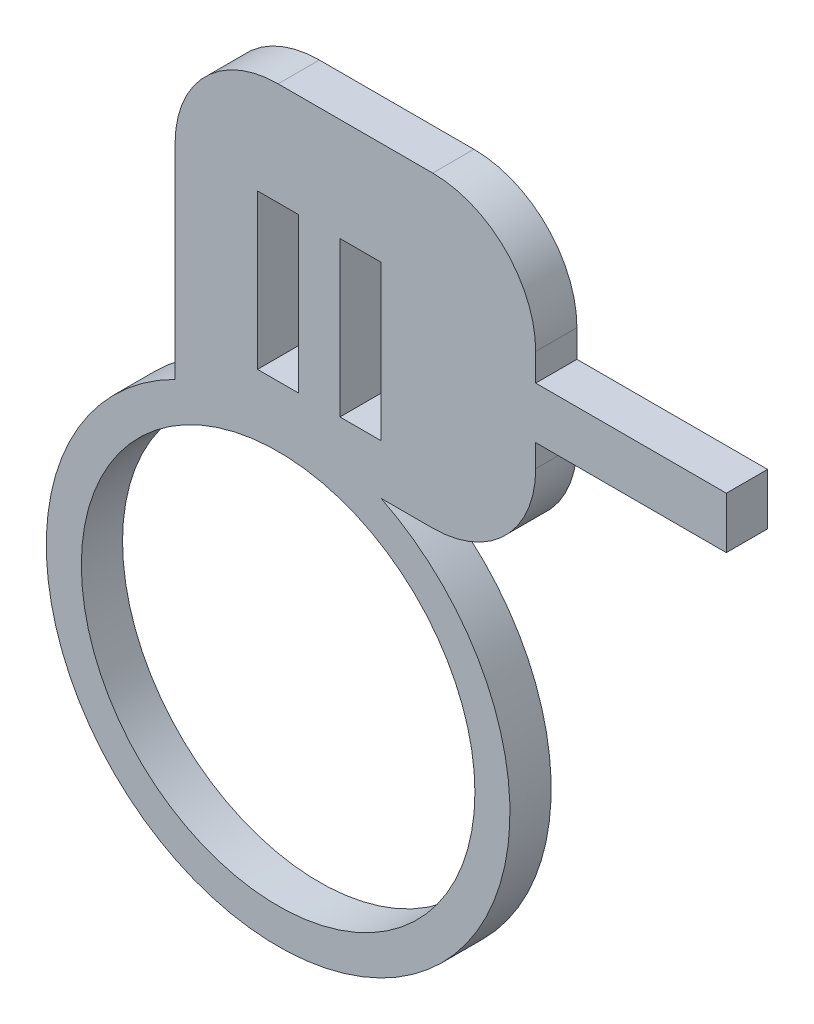
ISO-10303-21;
HEADER;
FILE_DESCRIPTION(('STEP AP214'),'2;1');
FILE_NAME('part.step','',(''),(''),'','','');
FILE_SCHEMA(('AUTOMOTIVE_DESIGN { 1 0 10303 214 1 1 1 1 }'));
ENDSEC;
DATA;
#1=APPLICATION_CONTEXT('core data for automotive mechanical design processes');
#2=APPLICATION_PROTOCOL_DEFINITION('international standard','automotive_design',2000,#1);
#3=PRODUCT_CONTEXT('',#1,'mechanical');
#4=PRODUCT('Part','Part','',(#3));
#5=PRODUCT_RELATED_PRODUCT_CATEGORY('part','',(#4));
#6=PRODUCT_DEFINITION_FORMATION('','',#4);
#7=PRODUCT_DEFINITION_CONTEXT('part definition',#1,'design');
#8=PRODUCT_DEFINITION('design','',#6,#7);
#9=PRODUCT_DEFINITION_SHAPE('','',#8);
#10=(LENGTH_UNIT() NAMED_UNIT(*) SI_UNIT(.MILLI.,.METRE.));
#11=(NAMED_UNIT(*) PLANE_ANGLE_UNIT() SI_UNIT($,.RADIAN.));
#12=(NAMED_UNIT(*) SI_UNIT($,.STERADIAN.) SOLID_ANGLE_UNIT());
#13=UNCERTAINTY_MEASURE_WITH_UNIT(LENGTH_MEASURE(1.E-05),#10,'distance_accuracy_value','');
#14=(GEOMETRIC_REPRESENTATION_CONTEXT(3) GLOBAL_UNCERTAINTY_ASSIGNED_CONTEXT((#13)) GLOBAL_UNIT_ASSIGNED_CONTEXT((#10,
#11,#12)) REPRESENTATION_CONTEXT('',''));
#15=CARTESIAN_POINT('',(0.,0.,0.));
#16=DIRECTION('',(0.,0.,1.));
#17=DIRECTION('',(1.,0.,0.));
#18=AXIS2_PLACEMENT_3D('',#15,#16,#17);
#19=CARTESIAN_POINT('',(31.75,0.,0.));
#20=DIRECTION('',(1.,0.,0.));
#21=DIRECTION('',(0.,0.,-1.));
#22=AXIS2_PLACEMENT_3D('',#19,#20,#21);
#23=PLANE('',#22);
#24=DIRECTION('',(0.,-1.,0.));
#25=VECTOR('',#24,1.);
#26=CARTESIAN_POINT('',(31.75,25.5976683508479,5.08));
#27=LINE('',#26,#25);
#28=CARTESIAN_POINT('',(31.75,50.8,5.08));
#29=VERTEX_POINT('',#28);
#30=CARTESIAN_POINT('',(31.75,47.4268816999342,5.08));
#31=VERTEX_POINT('',#30);
#32=EDGE_CURVE('E224',#29,#31,#27,.T.);
#33=ORIENTED_EDGE('',*,*,#32,.T.);
#34=DIRECTION('',(0.,0.,1.));
#35=VECTOR('',#34,1.);
#36=CARTESIAN_POINT('',(31.75,47.4268816999342,0.));
#37=LINE('',#36,#35);
#38=CARTESIAN_POINT('',(31.75,47.4268816999342,0.));
#39=VERTEX_POINT('',#38);
#40=EDGE_CURVE('E336',#39,#31,#37,.T.);
#41=ORIENTED_EDGE('',*,*,#40,.F.);
#42=DIRECTION('',(0.,1.,0.));
#43=VECTOR('',#42,1.);
#44=CARTESIAN_POINT('',(31.75,25.5976683508479,0.));
#45=LINE('',#44,#43);
#46=CARTESIAN_POINT('',(31.75,50.8,0.));
#47=VERTEX_POINT('',#46);
#48=EDGE_CURVE('E195',#39,#47,#45,.T.);
#49=ORIENTED_EDGE('',*,*,#48,.T.);
#50=DIRECTION('',(0.,0.,1.));
#51=VECTOR('',#50,1.);
#52=CARTESIAN_POINT('',(31.75,50.8,0.));
#53=LINE('',#52,#51);
#54=EDGE_CURVE('E300',#47,#29,#53,.T.);
#55=ORIENTED_EDGE('',*,*,#54,.T.);
#56=EDGE_LOOP('',(#33,#41,#49,#55));
#57=FACE_BOUND('',#56,.T.);
#58=ADVANCED_FACE('F34',(#57),#23,.T.);
#59=CARTESIAN_POINT('',(31.75,38.2976683508479,0.));
#60=VERTEX_POINT('',#59);
#61=CARTESIAN_POINT('',(31.75,41.0768816999342,0.));
#62=VERTEX_POINT('',#61);
#63=EDGE_CURVE('E220',#60,#62,#45,.T.);
#64=ORIENTED_EDGE('',*,*,#63,.T.);
#65=DIRECTION('',(0.,0.,-1.));
#66=VECTOR('',#65,1.);
#67=CARTESIAN_POINT('',(31.75,41.0768816999342,0.));
#68=LINE('',#67,#66);
#69=CARTESIAN_POINT('',(31.75,41.0768816999342,5.08));
#70=VERTEX_POINT('',#69);
#71=EDGE_CURVE('E189',#70,#62,#68,.T.);
#72=ORIENTED_EDGE('',*,*,#71,.F.);
#73=CARTESIAN_POINT('',(31.75,38.2976683508479,5.08));
#74=VERTEX_POINT('',#73);
#75=EDGE_CURVE('E223',#70,#74,#27,.T.);
#76=ORIENTED_EDGE('',*,*,#75,.T.);
#77=DIRECTION('',(0.,0.,-1.));
#78=VECTOR('',#77,1.);
#79=CARTESIAN_POINT('',(31.75,38.2976683508479,0.));
#80=LINE('',#79,#78);
#81=EDGE_CURVE('E303',#74,#60,#80,.T.);
#82=ORIENTED_EDGE('',*,*,#81,.T.);
#83=EDGE_LOOP('',(#64,#72,#76,#82));
#84=FACE_BOUND('',#83,.T.);
#85=ADVANCED_FACE('F358',(#84),#23,.T.);
#86=CARTESIAN_POINT('',(0.,0.,5.08));
#87=DIRECTION('',(0.,0.,-1.));
#88=DIRECTION('',(-1.,0.,0.));
#89=AXIS2_PLACEMENT_3D('',#86,#87,#88);
#90=CYLINDRICAL_SURFACE('',#89,28.575);
#91=DIRECTION('',(0.,0.,-1.));
#92=VECTOR('',#91,1.);
#93=CARTESIAN_POINT('',(12.7,25.5976683508479,5.08));
#94=LINE('',#93,#92);
#95=CARTESIAN_POINT('',(12.7,25.5976683508479,5.08));
#96=VERTEX_POINT('',#95);
#97=CARTESIAN_POINT('',(12.7,25.5976683508479,0.));
#98=VERTEX_POINT('',#97);
#99=EDGE_CURVE('E279',#96,#98,#94,.T.);
#100=ORIENTED_EDGE('',*,*,#99,.F.);
#101=CARTESIAN_POINT('',(0.,0.,5.08));
#102=DIRECTION('',(0.,0.,1.));
#103=DIRECTION('',(1.,0.,0.));
#104=AXIS2_PLACEMENT_3D('',#101,#102,#103);
#105=CIRCLE('',#104,28.575);
#106=CARTESIAN_POINT('',(-12.7,25.5976683508479,5.08));
#107=VERTEX_POINT('',#106);
#108=EDGE_CURVE('E283',#107,#96,#105,.T.);
#109=ORIENTED_EDGE('',*,*,#108,.F.);
#110=DIRECTION('',(0.,0.,-1.));
#111=VECTOR('',#110,1.);
#112=CARTESIAN_POINT('',(-12.7,25.5976683508479,5.08));
#113=LINE('',#112,#111);
#114=CARTESIAN_POINT('',(-12.7,25.5976683508479,0.));
#115=VERTEX_POINT('',#114);
#116=EDGE_CURVE('E276',#115,#107,#113,.F.);
#117=ORIENTED_EDGE('',*,*,#116,.F.);
#118=CARTESIAN_POINT('',(0.,0.,0.));
#119=DIRECTION('',(0.,0.,1.));
#120=DIRECTION('',(1.,0.,0.));
#121=AXIS2_PLACEMENT_3D('',#118,#119,#120);
#122=CIRCLE('',#121,28.575);
#123=EDGE_CURVE('E282',#115,#98,#122,.T.);
#124=ORIENTED_EDGE('',*,*,#123,.T.);
#125=EDGE_LOOP('',(#100,#109,#117,#124));
#126=FACE_BOUND('',#125,.T.);
#127=ADVANCED_FACE('F348',(#126),#90,.T.);
#128=CARTESIAN_POINT('',(0.,0.,5.08));
#129=DIRECTION('',(0.,0.,1.));
#130=DIRECTION('',(1.,0.,0.));
#131=AXIS2_PLACEMENT_3D('',#128,#129,#130);
#132=PLANE('',#131);
#133=DIRECTION('',(0.,-1.,0.));
#134=VECTOR('',#133,1.);
#135=CARTESIAN_POINT('',(7.61999999999999,31.75,5.08));
#136=LINE('',#135,#134);
#137=CARTESIAN_POINT('',(7.61999999999999,50.8,5.08));
#138=VERTEX_POINT('',#137);
#139=CARTESIAN_POINT('',(7.61999999999999,31.75,5.08));
#140=VERTEX_POINT('',#139);
#141=EDGE_CURVE('E196',#138,#140,#136,.T.);
#142=ORIENTED_EDGE('',*,*,#141,.F.);
#143=DIRECTION('',(-1.,0.,0.));
#144=VECTOR('',#143,1.);
#145=CARTESIAN_POINT('',(7.61999999999999,50.8,5.08));
#146=LINE('',#145,#144);
#147=CARTESIAN_POINT('',(12.7,50.8,5.08));
#148=VERTEX_POINT('',#147);
#149=EDGE_CURVE('E208',#148,#138,#146,.T.);
#150=ORIENTED_EDGE('',*,*,#149,.F.);
#151=DIRECTION('',(0.,1.,0.));
#152=VECTOR('',#151,1.);
#153=CARTESIAN_POINT('',(12.7,31.75,5.08));
#154=LINE('',#153,#152);
#155=CARTESIAN_POINT('',(12.7,31.75,5.08));
#156=VERTEX_POINT('',#155);
#157=EDGE_CURVE('E205',#156,#148,#154,.T.);
#158=ORIENTED_EDGE('',*,*,#157,.F.);
#159=DIRECTION('',(1.,0.,0.));
#160=VECTOR('',#159,1.);
#161=CARTESIAN_POINT('',(7.61999999999999,31.75,5.08));
#162=LINE('',#161,#160);
#163=EDGE_CURVE('E198',#140,#156,#162,.T.);
#164=ORIENTED_EDGE('',*,*,#163,.F.);
#165=EDGE_LOOP('',(#142,#150,#158,#164));
#166=FACE_BOUND('',#165,.T.);
#167=DIRECTION('',(0.,1.,0.));
#168=VECTOR('',#167,1.);
#169=CARTESIAN_POINT('',(2.53999999999999,0.,5.08));
#170=LINE('',#169,#168);
#171=CARTESIAN_POINT('',(2.53999999999999,31.75,5.08));
#172=VERTEX_POINT('',#171);
#173=CARTESIAN_POINT('',(2.53999999999999,50.8,5.08));
#174=VERTEX_POINT('',#173);
#175=EDGE_CURVE('E258',#172,#174,#170,.T.);
#176=ORIENTED_EDGE('',*,*,#175,.F.);
#177=DIRECTION('',(1.,0.,0.));
#178=VECTOR('',#177,1.);
#179=CARTESIAN_POINT('',(0.,31.75,5.08));
#180=LINE('',#179,#178);
#181=CARTESIAN_POINT('',(-2.54000000000001,31.75,5.08));
#182=VERTEX_POINT('',#181);
#183=EDGE_CURVE('E245',#182,#172,#180,.T.);
#184=ORIENTED_EDGE('',*,*,#183,.F.);
#185=DIRECTION('',(0.,-1.,0.));
#186=VECTOR('',#185,1.);
#187=CARTESIAN_POINT('',(-2.54000000000001,0.,5.08));
#188=LINE('',#187,#186);
#189=CARTESIAN_POINT('',(-2.54000000000001,50.8,5.08));
#190=VERTEX_POINT('',#189);
#191=EDGE_CURVE('E253',#190,#182,#188,.T.);
#192=ORIENTED_EDGE('',*,*,#191,.F.);
#193=DIRECTION('',(-1.,0.,0.));
#194=VECTOR('',#193,1.);
#195=CARTESIAN_POINT('',(0.,50.8,5.08));
#196=LINE('',#195,#194);
#197=EDGE_CURVE('E256',#174,#190,#196,.T.);
#198=ORIENTED_EDGE('',*,*,#197,.F.);
#199=EDGE_LOOP('',(#176,#184,#192,#198));
#200=FACE_BOUND('',#199,.T.);
#201=CARTESIAN_POINT('',(0.,0.,5.08));
#202=DIRECTION('',(0.,0.,1.));
#203=DIRECTION('',(1.,0.,0.));
#204=AXIS2_PLACEMENT_3D('',#201,#202,#203);
#205=CIRCLE('',#204,24.257);
#206=CARTESIAN_POINT('',(24.257,0.,5.08));
#207=VERTEX_POINT('',#206);
#208=EDGE_CURVE('E263',#207,#207,#205,.T.);
#209=ORIENTED_EDGE('',*,*,#208,.F.);
#210=EDGE_LOOP('',(#209));
#211=FACE_BOUND('',#210,.T.);
#212=DIRECTION('',(-1.,0.,0.));
#213=VECTOR('',#212,1.);
#214=CARTESIAN_POINT('',(31.75,25.5976683508479,5.08));
#215=LINE('',#214,#213);
#216=CARTESIAN_POINT('',(19.05,25.5976683508479,5.08));
#217=VERTEX_POINT('',#216);
#218=EDGE_CURVE('E229',#217,#96,#215,.T.);
#219=ORIENTED_EDGE('',*,*,#218,.F.);
#220=CARTESIAN_POINT('',(19.05,38.2976683508479,5.08));
#221=DIRECTION('',(0.,0.,1.));
#222=DIRECTION('',(1.,0.,0.));
#223=AXIS2_PLACEMENT_3D('',#220,#221,#222);
#224=CIRCLE('',#223,12.7);
#225=EDGE_CURVE('E317',#217,#74,#224,.T.);
#226=ORIENTED_EDGE('',*,*,#225,.T.);
#227=ORIENTED_EDGE('',*,*,#75,.F.);
#228=DIRECTION('',(-1.,0.,0.));
#229=VECTOR('',#228,1.);
#230=CARTESIAN_POINT('',(55.245,41.0768816999342,5.08));
#231=LINE('',#230,#229);
#232=CARTESIAN_POINT('',(55.245,41.0768816999342,5.08));
#233=VERTEX_POINT('',#232);
#234=EDGE_CURVE('E49',#233,#70,#231,.T.);
#235=ORIENTED_EDGE('',*,*,#234,.F.);
#236=DIRECTION('',(0.,-1.,0.));
#237=VECTOR('',#236,1.);
#238=CARTESIAN_POINT('',(55.245,41.0768816999342,5.08));
#239=LINE('',#238,#237);
#240=CARTESIAN_POINT('',(55.245,47.4268816999342,5.08));
#241=VERTEX_POINT('',#240);
#242=EDGE_CURVE('E180',#241,#233,#239,.T.);
#243=ORIENTED_EDGE('',*,*,#242,.F.);
#244=DIRECTION('',(-1.,0.,0.));
#245=VECTOR('',#244,1.);
#246=CARTESIAN_POINT('',(55.245,47.4268816999342,5.08));
#247=LINE('',#246,#245);
#248=EDGE_CURVE('E177',#241,#31,#247,.T.);
#249=ORIENTED_EDGE('',*,*,#248,.T.);
#250=ORIENTED_EDGE('',*,*,#32,.F.);
#251=CARTESIAN_POINT('',(19.05,50.8,5.08));
#252=DIRECTION('',(0.,0.,1.));
#253=DIRECTION('',(1.,0.,0.));
#254=AXIS2_PLACEMENT_3D('',#251,#252,#253);
#255=CIRCLE('',#254,12.7);
#256=CARTESIAN_POINT('',(19.05,63.5,5.08));
#257=VERTEX_POINT('',#256);
#258=EDGE_CURVE('E314',#29,#257,#255,.T.);
#259=ORIENTED_EDGE('',*,*,#258,.T.);
#260=DIRECTION('',(1.,0.,0.));
#261=VECTOR('',#260,1.);
#262=CARTESIAN_POINT('',(-12.7,63.5,5.08));
#263=LINE('',#262,#261);
#264=CARTESIAN_POINT('',(0.,63.5,5.08));
#265=VERTEX_POINT('',#264);
#266=EDGE_CURVE('E269',#265,#257,#263,.T.);
#267=ORIENTED_EDGE('',*,*,#266,.F.);
#268=CARTESIAN_POINT('',(0.,50.8,5.08));
#269=DIRECTION('',(0.,0.,1.));
#270=DIRECTION('',(1.,0.,0.));
#271=AXIS2_PLACEMENT_3D('',#268,#269,#270);
#272=CIRCLE('',#271,12.7);
#273=CARTESIAN_POINT('',(-12.7,50.8,5.08));
#274=VERTEX_POINT('',#273);
#275=EDGE_CURVE('E57',#265,#274,#272,.T.);
#276=ORIENTED_EDGE('',*,*,#275,.T.);
#277=DIRECTION('',(0.,-1.,0.));
#278=VECTOR('',#277,1.);
#279=CARTESIAN_POINT('',(-12.7,63.5,5.08));
#280=LINE('',#279,#278);
#281=EDGE_CURVE('E272',#274,#107,#280,.T.);
#282=ORIENTED_EDGE('',*,*,#281,.T.);
#283=ORIENTED_EDGE('',*,*,#108,.T.);
#284=EDGE_LOOP('',(#219,#226,#227,#235,#243,#249,#250,#259,#267,#276,#282,#283));
#285=FACE_BOUND('',#284,.T.);
#286=ADVANCED_FACE('F330',(#166,#200,#211,#285),#132,.T.);
#287=CARTESIAN_POINT('',(0.,0.,0.));
#288=DIRECTION('',(0.,0.,1.));
#289=DIRECTION('',(1.,0.,0.));
#290=AXIS2_PLACEMENT_3D('',#287,#288,#289);
#291=PLANE('',#290);
#292=DIRECTION('',(-1.,0.,0.));
#293=VECTOR('',#292,1.);
#294=CARTESIAN_POINT('',(0.,50.8,0.));
#295=LINE('',#294,#293);
#296=CARTESIAN_POINT('',(12.7,50.8,0.));
#297=VERTEX_POINT('',#296);
#298=CARTESIAN_POINT('',(7.61999999999999,50.8,0.));
#299=VERTEX_POINT('',#298);
#300=EDGE_CURVE('E294',#297,#299,#295,.T.);
#301=ORIENTED_EDGE('',*,*,#300,.T.);
#302=DIRECTION('',(0.,-1.,0.));
#303=VECTOR('',#302,1.);
#304=CARTESIAN_POINT('',(7.61999999999999,0.,0.));
#305=LINE('',#304,#303);
#306=CARTESIAN_POINT('',(7.61999999999999,31.75,0.));
#307=VERTEX_POINT('',#306);
#308=EDGE_CURVE('E297',#299,#307,#305,.T.);
#309=ORIENTED_EDGE('',*,*,#308,.T.);
#310=DIRECTION('',(1.,0.,0.));
#311=VECTOR('',#310,1.);
#312=CARTESIAN_POINT('',(0.,31.75,0.));
#313=LINE('',#312,#311);
#314=CARTESIAN_POINT('',(12.7,31.75,0.));
#315=VERTEX_POINT('',#314);
#316=EDGE_CURVE('E286',#307,#315,#313,.T.);
#317=ORIENTED_EDGE('',*,*,#316,.T.);
#318=DIRECTION('',(0.,1.,0.));
#319=VECTOR('',#318,1.);
#320=CARTESIAN_POINT('',(12.7,0.,0.));
#321=LINE('',#320,#319);
#322=EDGE_CURVE('E291',#315,#297,#321,.T.);
#323=ORIENTED_EDGE('',*,*,#322,.T.);
#324=EDGE_LOOP('',(#301,#309,#317,#323));
#325=FACE_BOUND('',#324,.T.);
#326=DIRECTION('',(-1.,0.,0.));
#327=VECTOR('',#326,1.);
#328=CARTESIAN_POINT('',(-2.54000000000001,31.75,0.));
#329=LINE('',#328,#327);
#330=CARTESIAN_POINT('',(2.53999999999999,31.75,0.));
#331=VERTEX_POINT('',#330);
#332=CARTESIAN_POINT('',(-2.54000000000001,31.75,0.));
#333=VERTEX_POINT('',#332);
#334=EDGE_CURVE('E233',#331,#333,#329,.T.);
#335=ORIENTED_EDGE('',*,*,#334,.F.);
#336=DIRECTION('',(0.,-1.,0.));
#337=VECTOR('',#336,1.);
#338=CARTESIAN_POINT('',(2.53999999999999,50.8,0.));
#339=LINE('',#338,#337);
#340=CARTESIAN_POINT('',(2.53999999999999,50.8,0.));
#341=VERTEX_POINT('',#340);
#342=EDGE_CURVE('E231',#341,#331,#339,.T.);
#343=ORIENTED_EDGE('',*,*,#342,.F.);
#344=DIRECTION('',(1.,0.,0.));
#345=VECTOR('',#344,1.);
#346=CARTESIAN_POINT('',(-2.54000000000001,50.8,0.));
#347=LINE('',#346,#345);
#348=CARTESIAN_POINT('',(-2.54000000000001,50.8,0.));
#349=VERTEX_POINT('',#348);
#350=EDGE_CURVE('E239',#349,#341,#347,.T.);
#351=ORIENTED_EDGE('',*,*,#350,.F.);
#352=DIRECTION('',(0.,1.,0.));
#353=VECTOR('',#352,1.);
#354=CARTESIAN_POINT('',(-2.54000000000001,50.8,0.));
#355=LINE('',#354,#353);
#356=EDGE_CURVE('E236',#333,#349,#355,.T.);
#357=ORIENTED_EDGE('',*,*,#356,.F.);
#358=EDGE_LOOP('',(#335,#343,#351,#357));
#359=FACE_BOUND('',#358,.T.);
#360=CARTESIAN_POINT('',(0.,0.,0.));
#361=DIRECTION('',(0.,0.,-1.));
#362=DIRECTION('',(-1.,0.,0.));
#363=AXIS2_PLACEMENT_3D('',#360,#361,#362);
#364=CIRCLE('',#363,24.257);
#365=CARTESIAN_POINT('',(-24.257,0.,0.));
#366=VERTEX_POINT('',#365);
#367=EDGE_CURVE('E260',#366,#366,#364,.T.);
#368=ORIENTED_EDGE('',*,*,#367,.F.);
#369=EDGE_LOOP('',(#368));
#370=FACE_BOUND('',#369,.T.);
#371=ORIENTED_EDGE('',*,*,#63,.F.);
#372=CARTESIAN_POINT('',(19.05,38.2976683508479,0.));
#373=DIRECTION('',(0.,0.,1.));
#374=DIRECTION('',(1.,0.,0.));
#375=AXIS2_PLACEMENT_3D('',#372,#373,#374);
#376=CIRCLE('',#375,12.7);
#377=CARTESIAN_POINT('',(19.05,25.5976683508479,0.));
#378=VERTEX_POINT('',#377);
#379=EDGE_CURVE('E310',#60,#378,#376,.F.);
#380=ORIENTED_EDGE('',*,*,#379,.T.);
#381=DIRECTION('',(-1.,0.,0.));
#382=VECTOR('',#381,1.);
#383=CARTESIAN_POINT('',(31.75,25.5976683508479,0.));
#384=LINE('',#383,#382);
#385=EDGE_CURVE('E227',#378,#98,#384,.T.);
#386=ORIENTED_EDGE('',*,*,#385,.T.);
#387=ORIENTED_EDGE('',*,*,#123,.F.);
#388=DIRECTION('',(0.,-1.,0.));
#389=VECTOR('',#388,1.);
#390=CARTESIAN_POINT('',(-12.7,63.5,0.));
#391=LINE('',#390,#389);
#392=CARTESIAN_POINT('',(-12.7,50.8,0.));
#393=VERTEX_POINT('',#392);
#394=EDGE_CURVE('E274',#393,#115,#391,.T.);
#395=ORIENTED_EDGE('',*,*,#394,.F.);
#396=CARTESIAN_POINT('',(0.,50.8,0.));
#397=DIRECTION('',(0.,0.,1.));
#398=DIRECTION('',(1.,0.,0.));
#399=AXIS2_PLACEMENT_3D('',#396,#397,#398);
#400=CIRCLE('',#399,12.7);
#401=CARTESIAN_POINT('',(0.,63.5,0.));
#402=VERTEX_POINT('',#401);
#403=EDGE_CURVE('E308',#393,#402,#400,.F.);
#404=ORIENTED_EDGE('',*,*,#403,.T.);
#405=DIRECTION('',(-1.,0.,0.));
#406=VECTOR('',#405,1.);
#407=CARTESIAN_POINT('',(-12.7,63.5,0.));
#408=LINE('',#407,#406);
#409=CARTESIAN_POINT('',(19.05,63.5,0.));
#410=VERTEX_POINT('',#409);
#411=EDGE_CURVE('E266',#410,#402,#408,.T.);
#412=ORIENTED_EDGE('',*,*,#411,.F.);
#413=CARTESIAN_POINT('',(19.05,50.8,0.));
#414=DIRECTION('',(0.,0.,1.));
#415=DIRECTION('',(1.,0.,0.));
#416=AXIS2_PLACEMENT_3D('',#413,#414,#415);
#417=CIRCLE('',#416,12.7);
#418=EDGE_CURVE('E306',#410,#47,#417,.F.);
#419=ORIENTED_EDGE('',*,*,#418,.T.);
#420=ORIENTED_EDGE('',*,*,#48,.F.);
#421=DIRECTION('',(-1.,0.,0.));
#422=VECTOR('',#421,1.);
#423=CARTESIAN_POINT('',(55.245,47.4268816999342,0.));
#424=LINE('',#423,#422);
#425=CARTESIAN_POINT('',(55.245,47.4268816999342,0.));
#426=VERTEX_POINT('',#425);
#427=EDGE_CURVE('E174',#426,#39,#424,.T.);
#428=ORIENTED_EDGE('',*,*,#427,.F.);
#429=DIRECTION('',(0.,1.,0.));
#430=VECTOR('',#429,1.);
#431=CARTESIAN_POINT('',(55.245,41.0768816999342,0.));
#432=LINE('',#431,#430);
#433=CARTESIAN_POINT('',(55.245,41.0768816999342,0.));
#434=VERTEX_POINT('',#433);
#435=EDGE_CURVE('E181',#434,#426,#432,.T.);
#436=ORIENTED_EDGE('',*,*,#435,.F.);
#437=DIRECTION('',(-1.,0.,0.));
#438=VECTOR('',#437,1.);
#439=CARTESIAN_POINT('',(55.245,41.0768816999342,0.));
#440=LINE('',#439,#438);
#441=EDGE_CURVE('E363',#434,#62,#440,.T.);
#442=ORIENTED_EDGE('',*,*,#441,.T.);
#443=EDGE_LOOP('',(#371,#380,#386,#387,#395,#404,#412,#419,#420,#428,#436,#442));
#444=FACE_BOUND('',#443,.T.);
#445=ADVANCED_FACE('F193',(#325,#359,#370,#444),#291,.F.);
#446=CARTESIAN_POINT('',(-12.7,63.5,0.));
#447=DIRECTION('',(1.,0.,0.));
#448=DIRECTION('',(0.,0.,-1.));
#449=AXIS2_PLACEMENT_3D('',#446,#447,#448);
#450=PLANE('',#449);
#451=ORIENTED_EDGE('',*,*,#281,.F.);
#452=DIRECTION('',(0.,0.,1.));
#453=VECTOR('',#452,1.);
#454=CARTESIAN_POINT('',(-12.7,50.8,0.));
#455=LINE('',#454,#453);
#456=EDGE_CURVE('E11',#274,#393,#455,.F.);
#457=ORIENTED_EDGE('',*,*,#456,.T.);
#458=ORIENTED_EDGE('',*,*,#394,.T.);
#459=ORIENTED_EDGE('',*,*,#116,.T.);
#460=EDGE_LOOP('',(#451,#457,#458,#459));
#461=FACE_BOUND('',#460,.T.);
#462=ADVANCED_FACE('F342',(#461),#450,.F.);
#463=CARTESIAN_POINT('',(0.,63.5,0.));
#464=DIRECTION('',(0.,1.,0.));
#465=DIRECTION('',(0.,0.,1.));
#466=AXIS2_PLACEMENT_3D('',#463,#464,#465);
#467=PLANE('',#466);
#468=ORIENTED_EDGE('',*,*,#411,.T.);
#469=DIRECTION('',(0.,0.,1.));
#470=VECTOR('',#469,1.);
#471=CARTESIAN_POINT('',(0.,63.5,5.08));
#472=LINE('',#471,#470);
#473=EDGE_CURVE('E42',#402,#265,#472,.T.);
#474=ORIENTED_EDGE('',*,*,#473,.T.);
#475=ORIENTED_EDGE('',*,*,#266,.T.);
#476=DIRECTION('',(0.,0.,1.));
#477=VECTOR('',#476,1.);
#478=CARTESIAN_POINT('',(19.05,63.5,0.));
#479=LINE('',#478,#477);
#480=EDGE_CURVE('E320',#257,#410,#479,.F.);
#481=ORIENTED_EDGE('',*,*,#480,.T.);
#482=EDGE_LOOP('',(#468,#474,#475,#481));
#483=FACE_BOUND('',#482,.T.);
#484=ADVANCED_FACE('F324',(#483),#467,.T.);
#485=CARTESIAN_POINT('',(0.,0.,50.8));
#486=DIRECTION('',(0.,0.,-1.));
#487=DIRECTION('',(-1.,0.,0.));
#488=AXIS2_PLACEMENT_3D('',#485,#486,#487);
#489=CYLINDRICAL_SURFACE('',#488,24.257);
#490=ORIENTED_EDGE('',*,*,#208,.T.);
#491=EDGE_LOOP('',(#490));
#492=FACE_BOUND('',#491,.T.);
#493=ORIENTED_EDGE('',*,*,#367,.T.);
#494=EDGE_LOOP('',(#493));
#495=FACE_BOUND('',#494,.T.);
#496=ADVANCED_FACE('F400',(#492,#495),#489,.F.);
#497=CARTESIAN_POINT('',(2.53999999999999,50.8,50.8));
#498=DIRECTION('',(1.,0.,0.));
#499=DIRECTION('',(0.,1.,0.));
#500=AXIS2_PLACEMENT_3D('',#497,#498,#499);
#501=PLANE('',#500);
#502=ORIENTED_EDGE('',*,*,#175,.T.);
#503=DIRECTION('',(0.,0.,-1.));
#504=VECTOR('',#503,1.);
#505=CARTESIAN_POINT('',(2.53999999999999,50.8,50.8));
#506=LINE('',#505,#504);
#507=EDGE_CURVE('E243',#174,#341,#506,.T.);
#508=ORIENTED_EDGE('',*,*,#507,.T.);
#509=ORIENTED_EDGE('',*,*,#342,.T.);
#510=DIRECTION('',(0.,0.,-1.));
#511=VECTOR('',#510,1.);
#512=CARTESIAN_POINT('',(2.53999999999999,31.75,50.8));
#513=LINE('',#512,#511);
#514=EDGE_CURVE('E242',#172,#331,#513,.T.);
#515=ORIENTED_EDGE('',*,*,#514,.F.);
#516=EDGE_LOOP('',(#502,#508,#509,#515));
#517=FACE_BOUND('',#516,.T.);
#518=ADVANCED_FACE('F390',(#517),#501,.F.);
#519=CARTESIAN_POINT('',(-2.54000000000001,50.8,50.8));
#520=DIRECTION('',(0.,1.,0.));
#521=DIRECTION('',(0.,0.,1.));
#522=AXIS2_PLACEMENT_3D('',#519,#520,#521);
#523=PLANE('',#522);
#524=ORIENTED_EDGE('',*,*,#197,.T.);
#525=DIRECTION('',(0.,0.,-1.));
#526=VECTOR('',#525,1.);
#527=CARTESIAN_POINT('',(-2.54000000000001,50.8,50.8));
#528=LINE('',#527,#526);
#529=EDGE_CURVE('E246',#190,#349,#528,.T.);
#530=ORIENTED_EDGE('',*,*,#529,.T.);
#531=ORIENTED_EDGE('',*,*,#350,.T.);
#532=ORIENTED_EDGE('',*,*,#507,.F.);
#533=EDGE_LOOP('',(#524,#530,#531,#532));
#534=FACE_BOUND('',#533,.T.);
#535=ADVANCED_FACE('F386',(#534),#523,.F.);
#536=CARTESIAN_POINT('',(-2.54000000000001,50.8,50.8));
#537=DIRECTION('',(-1.,0.,0.));
#538=DIRECTION('',(0.,-1.,0.));
#539=AXIS2_PLACEMENT_3D('',#536,#537,#538);
#540=PLANE('',#539);
#541=ORIENTED_EDGE('',*,*,#191,.T.);
#542=DIRECTION('',(0.,0.,-1.));
#543=VECTOR('',#542,1.);
#544=CARTESIAN_POINT('',(-2.54000000000001,31.75,50.8));
#545=LINE('',#544,#543);
#546=EDGE_CURVE('E248',#182,#333,#545,.T.);
#547=ORIENTED_EDGE('',*,*,#546,.T.);
#548=ORIENTED_EDGE('',*,*,#356,.T.);
#549=ORIENTED_EDGE('',*,*,#529,.F.);
#550=EDGE_LOOP('',(#541,#547,#548,#549));
#551=FACE_BOUND('',#550,.T.);
#552=ADVANCED_FACE('F389',(#551),#540,.F.);
#553=CARTESIAN_POINT('',(-2.54000000000001,31.75,50.8));
#554=DIRECTION('',(0.,-1.,0.));
#555=DIRECTION('',(0.,0.,-1.));
#556=AXIS2_PLACEMENT_3D('',#553,#554,#555);
#557=PLANE('',#556);
#558=ORIENTED_EDGE('',*,*,#183,.T.);
#559=ORIENTED_EDGE('',*,*,#514,.T.);
#560=ORIENTED_EDGE('',*,*,#334,.T.);
#561=ORIENTED_EDGE('',*,*,#546,.F.);
#562=EDGE_LOOP('',(#558,#559,#560,#561));
#563=FACE_BOUND('',#562,.T.);
#564=ADVANCED_FACE('F385',(#563),#557,.F.);
#565=CARTESIAN_POINT('',(31.75,25.5976683508479,0.));
#566=DIRECTION('',(0.,1.,0.));
#567=DIRECTION('',(0.,0.,1.));
#568=AXIS2_PLACEMENT_3D('',#565,#566,#567);
#569=PLANE('',#568);
#570=ORIENTED_EDGE('',*,*,#385,.F.);
#571=DIRECTION('',(0.,0.,-1.));
#572=VECTOR('',#571,1.);
#573=CARTESIAN_POINT('',(19.05,25.5976683508479,5.08));
#574=LINE('',#573,#572);
#575=EDGE_CURVE('E312',#378,#217,#574,.F.);
#576=ORIENTED_EDGE('',*,*,#575,.T.);
#577=ORIENTED_EDGE('',*,*,#218,.T.);
#578=ORIENTED_EDGE('',*,*,#99,.T.);
#579=EDGE_LOOP('',(#570,#576,#577,#578));
#580=FACE_BOUND('',#579,.T.);
#581=ADVANCED_FACE('F351',(#580),#569,.F.);
#582=CARTESIAN_POINT('',(7.61999999999999,31.75,-20.32));
#583=DIRECTION('',(-1.,0.,0.));
#584=DIRECTION('',(0.,0.,1.));
#585=AXIS2_PLACEMENT_3D('',#582,#583,#584);
#586=PLANE('',#585);
#587=DIRECTION('',(0.,0.,1.));
#588=VECTOR('',#587,1.);
#589=CARTESIAN_POINT('',(7.61999999999999,50.8,-20.32));
#590=LINE('',#589,#588);
#591=EDGE_CURVE('E212',#299,#138,#590,.T.);
#592=ORIENTED_EDGE('',*,*,#591,.T.);
#593=ORIENTED_EDGE('',*,*,#141,.T.);
#594=DIRECTION('',(0.,0.,1.));
#595=VECTOR('',#594,1.);
#596=CARTESIAN_POINT('',(7.61999999999999,31.75,-20.32));
#597=LINE('',#596,#595);
#598=EDGE_CURVE('E211',#307,#140,#597,.T.);
#599=ORIENTED_EDGE('',*,*,#598,.F.);
#600=ORIENTED_EDGE('',*,*,#308,.F.);
#601=EDGE_LOOP('',(#592,#593,#599,#600));
#602=FACE_BOUND('',#601,.T.);
#603=ADVANCED_FACE('F381',(#602),#586,.F.);
#604=CARTESIAN_POINT('',(7.61999999999999,50.8,-20.32));
#605=DIRECTION('',(0.,1.,0.));
#606=DIRECTION('',(0.,0.,1.));
#607=AXIS2_PLACEMENT_3D('',#604,#605,#606);
#608=PLANE('',#607);
#609=DIRECTION('',(0.,0.,1.));
#610=VECTOR('',#609,1.);
#611=CARTESIAN_POINT('',(12.7,50.8,-20.32));
#612=LINE('',#611,#610);
#613=EDGE_CURVE('E214',#297,#148,#612,.T.);
#614=ORIENTED_EDGE('',*,*,#613,.T.);
#615=ORIENTED_EDGE('',*,*,#149,.T.);
#616=ORIENTED_EDGE('',*,*,#591,.F.);
#617=ORIENTED_EDGE('',*,*,#300,.F.);
#618=EDGE_LOOP('',(#614,#615,#616,#617));
#619=FACE_BOUND('',#618,.T.);
#620=ADVANCED_FACE('F511',(#619),#608,.F.);
#621=CARTESIAN_POINT('',(12.7,31.75,-20.32));
#622=DIRECTION('',(1.,0.,0.));
#623=DIRECTION('',(0.,0.,-1.));
#624=AXIS2_PLACEMENT_3D('',#621,#622,#623);
#625=PLANE('',#624);
#626=DIRECTION('',(0.,0.,1.));
#627=VECTOR('',#626,1.);
#628=CARTESIAN_POINT('',(12.7,31.75,-20.32));
#629=LINE('',#628,#627);
#630=EDGE_CURVE('E216',#315,#156,#629,.T.);
#631=ORIENTED_EDGE('',*,*,#630,.T.);
#632=ORIENTED_EDGE('',*,*,#157,.T.);
#633=ORIENTED_EDGE('',*,*,#613,.F.);
#634=ORIENTED_EDGE('',*,*,#322,.F.);
#635=EDGE_LOOP('',(#631,#632,#633,#634));
#636=FACE_BOUND('',#635,.T.);
#637=ADVANCED_FACE('F518',(#636),#625,.F.);
#638=CARTESIAN_POINT('',(7.61999999999999,31.75,-20.32));
#639=DIRECTION('',(0.,-1.,0.));
#640=DIRECTION('',(0.,0.,-1.));
#641=AXIS2_PLACEMENT_3D('',#638,#639,#640);
#642=PLANE('',#641);
#643=ORIENTED_EDGE('',*,*,#598,.T.);
#644=ORIENTED_EDGE('',*,*,#163,.T.);
#645=ORIENTED_EDGE('',*,*,#630,.F.);
#646=ORIENTED_EDGE('',*,*,#316,.F.);
#647=EDGE_LOOP('',(#643,#644,#645,#646));
#648=FACE_BOUND('',#647,.T.);
#649=ADVANCED_FACE('F418',(#648),#642,.F.);
#650=CARTESIAN_POINT('',(19.05,38.2976683508479,0.));
#651=DIRECTION('',(0.,0.,1.));
#652=DIRECTION('',(0.,-1.,0.));
#653=AXIS2_PLACEMENT_3D('',#650,#651,#652);
#654=CYLINDRICAL_SURFACE('',#653,12.7);
#655=ORIENTED_EDGE('',*,*,#225,.F.);
#656=ORIENTED_EDGE('',*,*,#575,.F.);
#657=ORIENTED_EDGE('',*,*,#379,.F.);
#658=ORIENTED_EDGE('',*,*,#81,.F.);
#659=EDGE_LOOP('',(#655,#656,#657,#658));
#660=FACE_BOUND('',#659,.T.);
#661=ADVANCED_FACE('F354',(#660),#654,.T.);
#662=CARTESIAN_POINT('',(0.,50.8,0.));
#663=DIRECTION('',(0.,0.,-1.));
#664=DIRECTION('',(-1.,0.,0.));
#665=AXIS2_PLACEMENT_3D('',#662,#663,#664);
#666=CYLINDRICAL_SURFACE('',#665,12.7);
#667=ORIENTED_EDGE('',*,*,#403,.F.);
#668=ORIENTED_EDGE('',*,*,#456,.F.);
#669=ORIENTED_EDGE('',*,*,#275,.F.);
#670=ORIENTED_EDGE('',*,*,#473,.F.);
#671=EDGE_LOOP('',(#667,#668,#669,#670));
#672=FACE_BOUND('',#671,.T.);
#673=ADVANCED_FACE('F340',(#672),#666,.T.);
#674=CARTESIAN_POINT('',(19.05,50.8,0.));
#675=DIRECTION('',(0.,0.,1.));
#676=DIRECTION('',(1.,0.,0.));
#677=AXIS2_PLACEMENT_3D('',#674,#675,#676);
#678=CYLINDRICAL_SURFACE('',#677,12.7);
#679=ORIENTED_EDGE('',*,*,#418,.F.);
#680=ORIENTED_EDGE('',*,*,#480,.F.);
#681=ORIENTED_EDGE('',*,*,#258,.F.);
#682=ORIENTED_EDGE('',*,*,#54,.F.);
#683=EDGE_LOOP('',(#679,#680,#681,#682));
#684=FACE_BOUND('',#683,.T.);
#685=ADVANCED_FACE('F36',(#684),#678,.T.);
#686=CARTESIAN_POINT('',(55.245,47.4268816999342,0.));
#687=DIRECTION('',(0.,-1.,0.));
#688=DIRECTION('',(0.,0.,-1.));
#689=AXIS2_PLACEMENT_3D('',#686,#687,#688);
#690=PLANE('',#689);
#691=ORIENTED_EDGE('',*,*,#40,.T.);
#692=ORIENTED_EDGE('',*,*,#248,.F.);
#693=DIRECTION('',(0.,0.,1.));
#694=VECTOR('',#693,1.);
#695=CARTESIAN_POINT('',(55.245,47.4268816999342,0.));
#696=LINE('',#695,#694);
#697=EDGE_CURVE('E170',#426,#241,#696,.T.);
#698=ORIENTED_EDGE('',*,*,#697,.F.);
#699=ORIENTED_EDGE('',*,*,#427,.T.);
#700=EDGE_LOOP('',(#691,#692,#698,#699));
#701=FACE_BOUND('',#700,.T.);
#702=ADVANCED_FACE('F172',(#701),#690,.F.);
#703=CARTESIAN_POINT('',(55.245,41.0768816999342,0.));
#704=DIRECTION('',(0.,1.,0.));
#705=DIRECTION('',(0.,0.,1.));
#706=AXIS2_PLACEMENT_3D('',#703,#704,#705);
#707=PLANE('',#706);
#708=ORIENTED_EDGE('',*,*,#71,.T.);
#709=ORIENTED_EDGE('',*,*,#441,.F.);
#710=DIRECTION('',(0.,0.,-1.));
#711=VECTOR('',#710,1.);
#712=CARTESIAN_POINT('',(55.245,41.0768816999342,0.));
#713=LINE('',#712,#711);
#714=EDGE_CURVE('E185',#233,#434,#713,.T.);
#715=ORIENTED_EDGE('',*,*,#714,.F.);
#716=ORIENTED_EDGE('',*,*,#234,.T.);
#717=EDGE_LOOP('',(#708,#709,#715,#716));
#718=FACE_BOUND('',#717,.T.);
#719=ADVANCED_FACE('F365',(#718),#707,.F.);
#720=CARTESIAN_POINT('',(55.245,0.,0.));
#721=DIRECTION('',(1.,0.,0.));
#722=DIRECTION('',(0.,0.,-1.));
#723=AXIS2_PLACEMENT_3D('',#720,#721,#722);
#724=PLANE('',#723);
#725=ORIENTED_EDGE('',*,*,#435,.T.);
#726=ORIENTED_EDGE('',*,*,#697,.T.);
#727=ORIENTED_EDGE('',*,*,#242,.T.);
#728=ORIENTED_EDGE('',*,*,#714,.T.);
#729=EDGE_LOOP('',(#725,#726,#727,#728));
#730=FACE_BOUND('',#729,.T.);
#731=ADVANCED_FACE('F184',(#730),#724,.T.);
#732=CLOSED_SHELL('',(#58,#85,#127,#286,#445,#462,#484,#496,#518,#535,#552,#564,#581,#603,#620,
#637,#649,#661,#673,#685,#702,#719,#731));
#733=MANIFOLD_SOLID_BREP('B2',#732);
#734=ADVANCED_BREP_SHAPE_REPRESENTATION('',(#18,#733),#14);
#735=SHAPE_DEFINITION_REPRESENTATION(#9,#734);
ENDSEC;
END-ISO-10303-21;
